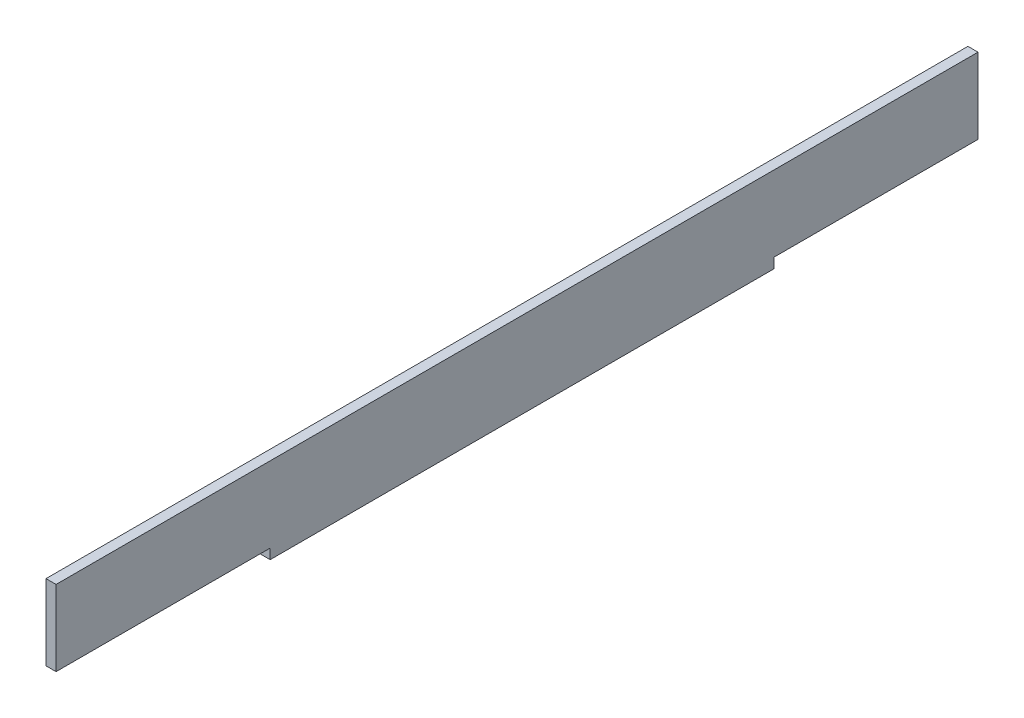
ISO-10303-21;
HEADER;
FILE_DESCRIPTION(('STEP AP214'),'2;1');
FILE_NAME('part.step','',(''),(''),'','','');
FILE_SCHEMA(('AUTOMOTIVE_DESIGN { 1 0 10303 214 1 1 1 1 }'));
ENDSEC;
DATA;
#1=APPLICATION_CONTEXT('core data for automotive mechanical design processes');
#2=APPLICATION_PROTOCOL_DEFINITION('international standard','automotive_design',2000,#1);
#3=PRODUCT_CONTEXT('',#1,'mechanical');
#4=PRODUCT('Part','Part','',(#3));
#5=PRODUCT_RELATED_PRODUCT_CATEGORY('part','',(#4));
#6=PRODUCT_DEFINITION_FORMATION('','',#4);
#7=PRODUCT_DEFINITION_CONTEXT('part definition',#1,'design');
#8=PRODUCT_DEFINITION('design','',#6,#7);
#9=PRODUCT_DEFINITION_SHAPE('','',#8);
#10=(LENGTH_UNIT() NAMED_UNIT(*) SI_UNIT(.MILLI.,.METRE.));
#11=(NAMED_UNIT(*) PLANE_ANGLE_UNIT() SI_UNIT($,.RADIAN.));
#12=(NAMED_UNIT(*) SI_UNIT($,.STERADIAN.) SOLID_ANGLE_UNIT());
#13=UNCERTAINTY_MEASURE_WITH_UNIT(LENGTH_MEASURE(1.E-05),#10,'distance_accuracy_value','');
#14=(GEOMETRIC_REPRESENTATION_CONTEXT(3) GLOBAL_UNCERTAINTY_ASSIGNED_CONTEXT((#13)) GLOBAL_UNIT_ASSIGNED_CONTEXT((#10,
#11,#12)) REPRESENTATION_CONTEXT('',''));
#15=CARTESIAN_POINT('',(0.,0.,0.));
#16=DIRECTION('',(0.,0.,1.));
#17=DIRECTION('',(1.,0.,0.));
#18=AXIS2_PLACEMENT_3D('',#15,#16,#17);
#19=CARTESIAN_POINT('',(4.,-12.9092396560933,97.2739172487467));
#20=DIRECTION('',(0.,0.,-1.));
#21=DIRECTION('',(-1.,0.,0.));
#22=AXIS2_PLACEMENT_3D('',#19,#20,#21);
#23=PLANE('',#22);
#24=DIRECTION('',(0.,-1.,0.));
#25=VECTOR('',#24,1.);
#26=CARTESIAN_POINT('',(0.,-12.9092396560933,97.2739172487467));
#27=LINE('',#26,#25);
#28=CARTESIAN_POINT('',(0.,-12.9092396560933,97.2739172487467));
#29=VERTEX_POINT('',#28);
#30=CARTESIAN_POINT('',(0.,-16.9092396560933,97.2739172487467));
#31=VERTEX_POINT('',#30);
#32=EDGE_CURVE('E148',#29,#31,#27,.T.);
#33=ORIENTED_EDGE('',*,*,#32,.T.);
#34=DIRECTION('',(-1.,0.,0.));
#35=VECTOR('',#34,1.);
#36=CARTESIAN_POINT('',(4.,-16.9092396560933,97.2739172487467));
#37=LINE('',#36,#35);
#38=CARTESIAN_POINT('',(4.,-16.9092396560933,97.2739172487467));
#39=VERTEX_POINT('',#38);
#40=EDGE_CURVE('E11',#39,#31,#37,.T.);
#41=ORIENTED_EDGE('',*,*,#40,.F.);
#42=DIRECTION('',(0.,-1.,0.));
#43=VECTOR('',#42,1.);
#44=CARTESIAN_POINT('',(4.,-12.9092396560933,97.2739172487467));
#45=LINE('',#44,#43);
#46=CARTESIAN_POINT('',(4.,-12.9092396560933,97.2739172487467));
#47=VERTEX_POINT('',#46);
#48=EDGE_CURVE('E171',#47,#39,#45,.T.);
#49=ORIENTED_EDGE('',*,*,#48,.F.);
#50=DIRECTION('',(-1.,0.,0.));
#51=VECTOR('',#50,1.);
#52=CARTESIAN_POINT('',(4.,-12.9092396560933,97.2739172487467));
#53=LINE('',#52,#51);
#54=EDGE_CURVE('E144',#47,#29,#53,.T.);
#55=ORIENTED_EDGE('',*,*,#54,.T.);
#56=EDGE_LOOP('',(#33,#41,#49,#55));
#57=FACE_BOUND('',#56,.T.);
#58=ADVANCED_FACE('F48',(#57),#23,.F.);
#59=CARTESIAN_POINT('',(4.,-16.9092396560933,97.2739172487467));
#60=DIRECTION('',(0.,1.,0.));
#61=DIRECTION('',(0.,0.,1.));
#62=AXIS2_PLACEMENT_3D('',#59,#60,#61);
#63=PLANE('',#62);
#64=DIRECTION('',(0.,0.,-1.));
#65=VECTOR('',#64,1.);
#66=CARTESIAN_POINT('',(0.,-16.9092396560933,97.2739172487467));
#67=LINE('',#66,#65);
#68=CARTESIAN_POINT('',(0.,-16.9092396560933,-102.726082751253));
#69=VERTEX_POINT('',#68);
#70=EDGE_CURVE('E152',#31,#69,#67,.T.);
#71=ORIENTED_EDGE('',*,*,#70,.T.);
#72=DIRECTION('',(-1.,0.,0.));
#73=VECTOR('',#72,1.);
#74=CARTESIAN_POINT('',(4.,-16.9092396560933,-102.726082751253));
#75=LINE('',#74,#73);
#76=CARTESIAN_POINT('',(4.,-16.9092396560933,-102.726082751253));
#77=VERTEX_POINT('',#76);
#78=EDGE_CURVE('E57',#77,#69,#75,.T.);
#79=ORIENTED_EDGE('',*,*,#78,.F.);
#80=DIRECTION('',(0.,0.,-1.));
#81=VECTOR('',#80,1.);
#82=CARTESIAN_POINT('',(4.,-16.9092396560933,97.2739172487467));
#83=LINE('',#82,#81);
#84=EDGE_CURVE('E108',#39,#77,#83,.T.);
#85=ORIENTED_EDGE('',*,*,#84,.F.);
#86=ORIENTED_EDGE('',*,*,#40,.T.);
#87=EDGE_LOOP('',(#71,#79,#85,#86));
#88=FACE_BOUND('',#87,.T.);
#89=ADVANCED_FACE('F217',(#88),#63,.F.);
#90=CARTESIAN_POINT('',(4.,-16.9092396560933,-102.726082751253));
#91=DIRECTION('',(0.,0.,1.));
#92=DIRECTION('',(1.,0.,0.));
#93=AXIS2_PLACEMENT_3D('',#90,#91,#92);
#94=PLANE('',#93);
#95=DIRECTION('',(0.,1.,0.));
#96=VECTOR('',#95,1.);
#97=CARTESIAN_POINT('',(0.,-16.9092396560933,-102.726082751253));
#98=LINE('',#97,#96);
#99=CARTESIAN_POINT('',(0.,-12.9092396560933,-102.726082751253));
#100=VERTEX_POINT('',#99);
#101=EDGE_CURVE('E155',#69,#100,#98,.T.);
#102=ORIENTED_EDGE('',*,*,#101,.T.);
#103=DIRECTION('',(-1.,0.,0.));
#104=VECTOR('',#103,1.);
#105=CARTESIAN_POINT('',(4.,-12.9092396560933,-102.726082751253));
#106=LINE('',#105,#104);
#107=CARTESIAN_POINT('',(4.,-12.9092396560933,-102.726082751253));
#108=VERTEX_POINT('',#107);
#109=EDGE_CURVE('E182',#108,#100,#106,.T.);
#110=ORIENTED_EDGE('',*,*,#109,.F.);
#111=DIRECTION('',(0.,1.,0.));
#112=VECTOR('',#111,1.);
#113=CARTESIAN_POINT('',(4.,-16.9092396560933,-102.726082751253));
#114=LINE('',#113,#112);
#115=EDGE_CURVE('E192',#77,#108,#114,.T.);
#116=ORIENTED_EDGE('',*,*,#115,.F.);
#117=ORIENTED_EDGE('',*,*,#78,.T.);
#118=EDGE_LOOP('',(#102,#110,#116,#117));
#119=FACE_BOUND('',#118,.T.);
#120=ADVANCED_FACE('F190',(#119),#94,.F.);
#121=CARTESIAN_POINT('',(4.,-12.9092396560933,-102.726082751253));
#122=DIRECTION('',(0.,1.,0.));
#123=DIRECTION('',(0.,0.,1.));
#124=AXIS2_PLACEMENT_3D('',#121,#122,#123);
#125=PLANE('',#124);
#126=DIRECTION('',(0.,0.,-1.));
#127=VECTOR('',#126,1.);
#128=CARTESIAN_POINT('',(0.,-12.9092396560933,-102.726082751253));
#129=LINE('',#128,#127);
#130=CARTESIAN_POINT('',(0.,-12.9092396560933,-183.726082751253));
#131=VERTEX_POINT('',#130);
#132=EDGE_CURVE('E158',#100,#131,#129,.T.);
#133=ORIENTED_EDGE('',*,*,#132,.T.);
#134=DIRECTION('',(-1.,0.,0.));
#135=VECTOR('',#134,1.);
#136=CARTESIAN_POINT('',(4.,-12.9092396560933,-183.726082751253));
#137=LINE('',#136,#135);
#138=CARTESIAN_POINT('',(4.,-12.9092396560933,-183.726082751253));
#139=VERTEX_POINT('',#138);
#140=EDGE_CURVE('E178',#139,#131,#137,.T.);
#141=ORIENTED_EDGE('',*,*,#140,.F.);
#142=DIRECTION('',(0.,0.,-1.));
#143=VECTOR('',#142,1.);
#144=CARTESIAN_POINT('',(4.,-12.9092396560933,-102.726082751253));
#145=LINE('',#144,#143);
#146=EDGE_CURVE('E205',#108,#139,#145,.T.);
#147=ORIENTED_EDGE('',*,*,#146,.F.);
#148=ORIENTED_EDGE('',*,*,#109,.T.);
#149=EDGE_LOOP('',(#133,#141,#147,#148));
#150=FACE_BOUND('',#149,.T.);
#151=ADVANCED_FACE('F200',(#150),#125,.F.);
#152=CARTESIAN_POINT('',(4.,-12.9092396560933,-183.726082751253));
#153=DIRECTION('',(0.,0.,1.));
#154=DIRECTION('',(1.,0.,0.));
#155=AXIS2_PLACEMENT_3D('',#152,#153,#154);
#156=PLANE('',#155);
#157=DIRECTION('',(0.,1.,0.));
#158=VECTOR('',#157,1.);
#159=CARTESIAN_POINT('',(0.,-12.9092396560933,-183.726082751253));
#160=LINE('',#159,#158);
#161=CARTESIAN_POINT('',(0.,17.0907603439067,-183.726082751253));
#162=VERTEX_POINT('',#161);
#163=EDGE_CURVE('E161',#131,#162,#160,.T.);
#164=ORIENTED_EDGE('',*,*,#163,.T.);
#165=DIRECTION('',(-1.,0.,0.));
#166=VECTOR('',#165,1.);
#167=CARTESIAN_POINT('',(4.,17.0907603439067,-183.726082751253));
#168=LINE('',#167,#166);
#169=CARTESIAN_POINT('',(4.,17.0907603439067,-183.726082751253));
#170=VERTEX_POINT('',#169);
#171=EDGE_CURVE('E137',#170,#162,#168,.T.);
#172=ORIENTED_EDGE('',*,*,#171,.F.);
#173=DIRECTION('',(0.,1.,0.));
#174=VECTOR('',#173,1.);
#175=CARTESIAN_POINT('',(4.,-12.9092396560933,-183.726082751253));
#176=LINE('',#175,#174);
#177=EDGE_CURVE('E127',#139,#170,#176,.T.);
#178=ORIENTED_EDGE('',*,*,#177,.F.);
#179=ORIENTED_EDGE('',*,*,#140,.T.);
#180=EDGE_LOOP('',(#164,#172,#178,#179));
#181=FACE_BOUND('',#180,.T.);
#182=ADVANCED_FACE('F203',(#181),#156,.F.);
#183=CARTESIAN_POINT('',(4.,17.0907603439067,97.2739172487467));
#184=DIRECTION('',(0.,-1.,0.));
#185=DIRECTION('',(0.,0.,-1.));
#186=AXIS2_PLACEMENT_3D('',#183,#184,#185);
#187=PLANE('',#186);
#188=DIRECTION('',(0.,0.,1.));
#189=VECTOR('',#188,1.);
#190=CARTESIAN_POINT('',(0.,17.0907603439067,97.2739172487467));
#191=LINE('',#190,#189);
#192=CARTESIAN_POINT('',(0.,17.0907603439067,182.273917248747));
#193=VERTEX_POINT('',#192);
#194=EDGE_CURVE('E135',#162,#193,#191,.T.);
#195=ORIENTED_EDGE('',*,*,#194,.T.);
#196=DIRECTION('',(-1.,0.,0.));
#197=VECTOR('',#196,1.);
#198=CARTESIAN_POINT('',(4.,17.0907603439067,182.273917248747));
#199=LINE('',#198,#197);
#200=CARTESIAN_POINT('',(4.,17.0907603439067,182.273917248747));
#201=VERTEX_POINT('',#200);
#202=EDGE_CURVE('E133',#201,#193,#199,.T.);
#203=ORIENTED_EDGE('',*,*,#202,.F.);
#204=DIRECTION('',(0.,0.,1.));
#205=VECTOR('',#204,1.);
#206=CARTESIAN_POINT('',(4.,17.0907603439067,-183.726082751253));
#207=LINE('',#206,#205);
#208=EDGE_CURVE('E121',#170,#201,#207,.T.);
#209=ORIENTED_EDGE('',*,*,#208,.F.);
#210=ORIENTED_EDGE('',*,*,#171,.T.);
#211=EDGE_LOOP('',(#195,#203,#209,#210));
#212=FACE_BOUND('',#211,.T.);
#213=ADVANCED_FACE('F134',(#212),#187,.F.);
#214=CARTESIAN_POINT('',(4.,17.0907603439067,182.273917248747));
#215=DIRECTION('',(0.,0.,-1.));
#216=DIRECTION('',(-1.,0.,0.));
#217=AXIS2_PLACEMENT_3D('',#214,#215,#216);
#218=PLANE('',#217);
#219=DIRECTION('',(0.,-1.,0.));
#220=VECTOR('',#219,1.);
#221=CARTESIAN_POINT('',(0.,17.0907603439067,182.273917248747));
#222=LINE('',#221,#220);
#223=CARTESIAN_POINT('',(0.,-12.9092396560933,182.273917248747));
#224=VERTEX_POINT('',#223);
#225=EDGE_CURVE('E94',#193,#224,#222,.T.);
#226=ORIENTED_EDGE('',*,*,#225,.T.);
#227=DIRECTION('',(-1.,0.,0.));
#228=VECTOR('',#227,1.);
#229=CARTESIAN_POINT('',(4.,-12.9092396560933,182.273917248747));
#230=LINE('',#229,#228);
#231=CARTESIAN_POINT('',(4.,-12.9092396560933,182.273917248747));
#232=VERTEX_POINT('',#231);
#233=EDGE_CURVE('E138',#232,#224,#230,.T.);
#234=ORIENTED_EDGE('',*,*,#233,.F.);
#235=DIRECTION('',(0.,-1.,0.));
#236=VECTOR('',#235,1.);
#237=CARTESIAN_POINT('',(4.,17.0907603439067,182.273917248747));
#238=LINE('',#237,#236);
#239=EDGE_CURVE('E125',#201,#232,#238,.T.);
#240=ORIENTED_EDGE('',*,*,#239,.F.);
#241=ORIENTED_EDGE('',*,*,#202,.T.);
#242=EDGE_LOOP('',(#226,#234,#240,#241));
#243=FACE_BOUND('',#242,.T.);
#244=ADVANCED_FACE('F140',(#243),#218,.F.);
#245=CARTESIAN_POINT('',(4.,-12.9092396560933,182.273917248747));
#246=DIRECTION('',(0.,1.,0.));
#247=DIRECTION('',(0.,0.,1.));
#248=AXIS2_PLACEMENT_3D('',#245,#246,#247);
#249=PLANE('',#248);
#250=DIRECTION('',(0.,0.,-1.));
#251=VECTOR('',#250,1.);
#252=CARTESIAN_POINT('',(0.,-12.9092396560933,182.273917248747));
#253=LINE('',#252,#251);
#254=EDGE_CURVE('E100',#224,#29,#253,.T.);
#255=ORIENTED_EDGE('',*,*,#254,.T.);
#256=ORIENTED_EDGE('',*,*,#54,.F.);
#257=DIRECTION('',(0.,0.,-1.));
#258=VECTOR('',#257,1.);
#259=CARTESIAN_POINT('',(4.,-12.9092396560933,182.273917248747));
#260=LINE('',#259,#258);
#261=EDGE_CURVE('E65',#232,#47,#260,.T.);
#262=ORIENTED_EDGE('',*,*,#261,.F.);
#263=ORIENTED_EDGE('',*,*,#233,.T.);
#264=EDGE_LOOP('',(#255,#256,#262,#263));
#265=FACE_BOUND('',#264,.T.);
#266=ADVANCED_FACE('F233',(#265),#249,.F.);
#267=CARTESIAN_POINT('',(4.,0.,0.));
#268=DIRECTION('',(1.,0.,0.));
#269=DIRECTION('',(0.,0.,-1.));
#270=AXIS2_PLACEMENT_3D('',#267,#268,#269);
#271=PLANE('',#270);
#272=ORIENTED_EDGE('',*,*,#48,.T.);
#273=ORIENTED_EDGE('',*,*,#84,.T.);
#274=ORIENTED_EDGE('',*,*,#115,.T.);
#275=ORIENTED_EDGE('',*,*,#146,.T.);
#276=ORIENTED_EDGE('',*,*,#177,.T.);
#277=ORIENTED_EDGE('',*,*,#208,.T.);
#278=ORIENTED_EDGE('',*,*,#239,.T.);
#279=ORIENTED_EDGE('',*,*,#261,.T.);
#280=EDGE_LOOP('',(#272,#273,#274,#275,#276,#277,#278,#279));
#281=FACE_BOUND('',#280,.T.);
#282=ADVANCED_FACE('F123',(#281),#271,.T.);
#283=CARTESIAN_POINT('',(0.,0.,0.));
#284=DIRECTION('',(1.,0.,0.));
#285=DIRECTION('',(0.,0.,-1.));
#286=AXIS2_PLACEMENT_3D('',#283,#284,#285);
#287=PLANE('',#286);
#288=ORIENTED_EDGE('',*,*,#32,.F.);
#289=ORIENTED_EDGE('',*,*,#254,.F.);
#290=ORIENTED_EDGE('',*,*,#225,.F.);
#291=ORIENTED_EDGE('',*,*,#194,.F.);
#292=ORIENTED_EDGE('',*,*,#163,.F.);
#293=ORIENTED_EDGE('',*,*,#132,.F.);
#294=ORIENTED_EDGE('',*,*,#101,.F.);
#295=ORIENTED_EDGE('',*,*,#70,.F.);
#296=EDGE_LOOP('',(#288,#289,#290,#291,#292,#293,#294,#295));
#297=FACE_BOUND('',#296,.T.);
#298=ADVANCED_FACE('F196',(#297),#287,.F.);
#299=CLOSED_SHELL('',(#58,#89,#120,#151,#182,#213,#244,#266,#282,#298));
#300=MANIFOLD_SOLID_BREP('B2',#299);
#301=ADVANCED_BREP_SHAPE_REPRESENTATION('',(#18,#300),#14);
#302=SHAPE_DEFINITION_REPRESENTATION(#9,#301);
ENDSEC;
END-ISO-10303-21;
